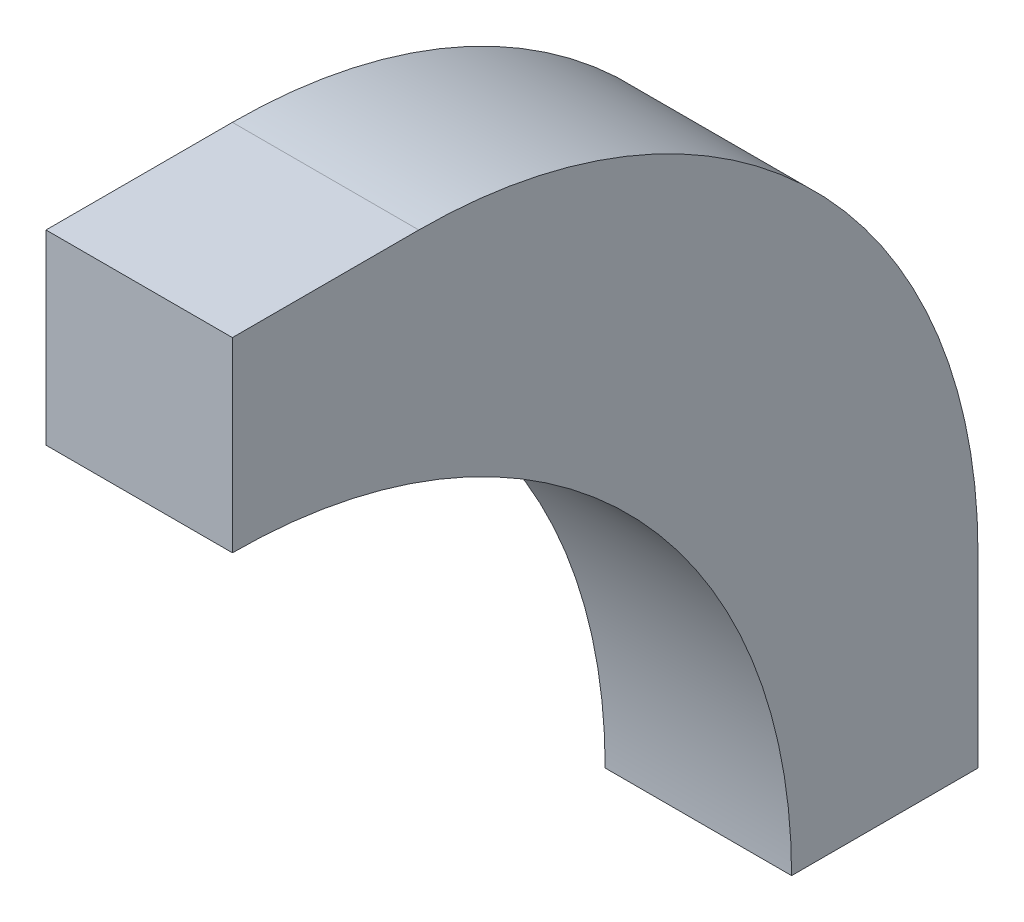
ISO-10303-21;
HEADER;
FILE_DESCRIPTION(('STEP AP214'),'2;1');
FILE_NAME('part.step','',(''),(''),'','','');
FILE_SCHEMA(('AUTOMOTIVE_DESIGN { 1 0 10303 214 1 1 1 1 }'));
ENDSEC;
DATA;
#1=APPLICATION_CONTEXT('core data for automotive mechanical design processes');
#2=APPLICATION_PROTOCOL_DEFINITION('international standard','automotive_design',2000,#1);
#3=PRODUCT_CONTEXT('',#1,'mechanical');
#4=PRODUCT('Part','Part','',(#3));
#5=PRODUCT_RELATED_PRODUCT_CATEGORY('part','',(#4));
#6=PRODUCT_DEFINITION_FORMATION('','',#4);
#7=PRODUCT_DEFINITION_CONTEXT('part definition',#1,'design');
#8=PRODUCT_DEFINITION('design','',#6,#7);
#9=PRODUCT_DEFINITION_SHAPE('','',#8);
#10=(LENGTH_UNIT() NAMED_UNIT(*) SI_UNIT(.MILLI.,.METRE.));
#11=(NAMED_UNIT(*) PLANE_ANGLE_UNIT() SI_UNIT($,.RADIAN.));
#12=(NAMED_UNIT(*) SI_UNIT($,.STERADIAN.) SOLID_ANGLE_UNIT());
#13=UNCERTAINTY_MEASURE_WITH_UNIT(LENGTH_MEASURE(1.E-05),#10,'distance_accuracy_value','');
#14=(GEOMETRIC_REPRESENTATION_CONTEXT(3) GLOBAL_UNCERTAINTY_ASSIGNED_CONTEXT((#13)) GLOBAL_UNIT_ASSIGNED_CONTEXT((#10,
#11,#12)) REPRESENTATION_CONTEXT('',''));
#15=CARTESIAN_POINT('',(0.,0.,0.));
#16=DIRECTION('',(0.,0.,1.));
#17=DIRECTION('',(1.,0.,0.));
#18=AXIS2_PLACEMENT_3D('',#15,#16,#17);
#19=CARTESIAN_POINT('',(12.7,0.,12.7));
#20=DIRECTION('',(0.,1.,0.));
#21=DIRECTION('',(0.,0.,1.));
#22=AXIS2_PLACEMENT_3D('',#19,#20,#21);
#23=PLANE('',#22);
#24=DIRECTION('',(0.,0.,-1.));
#25=VECTOR('',#24,1.);
#26=CARTESIAN_POINT('',(0.,0.,12.7));
#27=LINE('',#26,#25);
#28=CARTESIAN_POINT('',(0.,0.,12.7));
#29=VERTEX_POINT('',#28);
#30=CARTESIAN_POINT('',(0.,0.,0.));
#31=VERTEX_POINT('',#30);
#32=EDGE_CURVE('E103',#29,#31,#27,.T.);
#33=ORIENTED_EDGE('',*,*,#32,.T.);
#34=DIRECTION('',(-1.,0.,0.));
#35=VECTOR('',#34,1.);
#36=CARTESIAN_POINT('',(12.7,0.,0.));
#37=LINE('',#36,#35);
#38=CARTESIAN_POINT('',(12.7,0.,0.));
#39=VERTEX_POINT('',#38);
#40=EDGE_CURVE('E86',#39,#31,#37,.T.);
#41=ORIENTED_EDGE('',*,*,#40,.F.);
#42=DIRECTION('',(0.,0.,-1.));
#43=VECTOR('',#42,1.);
#44=CARTESIAN_POINT('',(12.7,0.,12.7));
#45=LINE('',#44,#43);
#46=CARTESIAN_POINT('',(12.7,0.,12.7));
#47=VERTEX_POINT('',#46);
#48=EDGE_CURVE('E91',#47,#39,#45,.T.);
#49=ORIENTED_EDGE('',*,*,#48,.F.);
#50=DIRECTION('',(-1.,0.,0.));
#51=VECTOR('',#50,1.);
#52=CARTESIAN_POINT('',(12.7,0.,12.7));
#53=LINE('',#52,#51);
#54=EDGE_CURVE('E133',#47,#29,#53,.T.);
#55=ORIENTED_EDGE('',*,*,#54,.T.);
#56=EDGE_LOOP('',(#33,#41,#49,#55));
#57=FACE_BOUND('',#56,.T.);
#58=ADVANCED_FACE('F33',(#57),#23,.F.);
#59=CARTESIAN_POINT('',(12.7,0.,0.));
#60=DIRECTION('',(0.,0.,1.));
#61=DIRECTION('',(1.,0.,0.));
#62=AXIS2_PLACEMENT_3D('',#59,#60,#61);
#63=PLANE('',#62);
#64=DIRECTION('',(0.,1.,0.));
#65=VECTOR('',#64,1.);
#66=CARTESIAN_POINT('',(0.,0.,0.));
#67=LINE('',#66,#65);
#68=CARTESIAN_POINT('',(0.,12.7,0.));
#69=VERTEX_POINT('',#68);
#70=EDGE_CURVE('E127',#31,#69,#67,.T.);
#71=ORIENTED_EDGE('',*,*,#70,.T.);
#72=DIRECTION('',(-1.,0.,0.));
#73=VECTOR('',#72,1.);
#74=CARTESIAN_POINT('',(12.7,12.7,0.));
#75=LINE('',#74,#73);
#76=CARTESIAN_POINT('',(12.7,12.7,0.));
#77=VERTEX_POINT('',#76);
#78=EDGE_CURVE('E41',#69,#77,#75,.F.);
#79=ORIENTED_EDGE('',*,*,#78,.T.);
#80=DIRECTION('',(0.,1.,0.));
#81=VECTOR('',#80,1.);
#82=CARTESIAN_POINT('',(12.7,0.,0.));
#83=LINE('',#82,#81);
#84=EDGE_CURVE('E82',#39,#77,#83,.T.);
#85=ORIENTED_EDGE('',*,*,#84,.F.);
#86=ORIENTED_EDGE('',*,*,#40,.T.);
#87=EDGE_LOOP('',(#71,#79,#85,#86));
#88=FACE_BOUND('',#87,.T.);
#89=ADVANCED_FACE('F84',(#88),#63,.F.);
#90=CARTESIAN_POINT('',(12.7,50.8,0.));
#91=DIRECTION('',(0.,-1.,0.));
#92=DIRECTION('',(0.,0.,-1.));
#93=AXIS2_PLACEMENT_3D('',#90,#91,#92);
#94=PLANE('',#93);
#95=DIRECTION('',(0.,0.,1.));
#96=VECTOR('',#95,1.);
#97=CARTESIAN_POINT('',(12.7,50.8,0.));
#98=LINE('',#97,#96);
#99=CARTESIAN_POINT('',(12.7,50.8,38.1));
#100=VERTEX_POINT('',#99);
#101=CARTESIAN_POINT('',(12.7,50.8,50.8));
#102=VERTEX_POINT('',#101);
#103=EDGE_CURVE('E90',#100,#102,#98,.T.);
#104=ORIENTED_EDGE('',*,*,#103,.F.);
#105=DIRECTION('',(-1.,0.,0.));
#106=VECTOR('',#105,1.);
#107=CARTESIAN_POINT('',(12.7,50.8,38.1));
#108=LINE('',#107,#106);
#109=CARTESIAN_POINT('',(0.,50.8,38.1));
#110=VERTEX_POINT('',#109);
#111=EDGE_CURVE('E114',#100,#110,#108,.T.);
#112=ORIENTED_EDGE('',*,*,#111,.T.);
#113=DIRECTION('',(0.,0.,1.));
#114=VECTOR('',#113,1.);
#115=CARTESIAN_POINT('',(0.,50.8,0.));
#116=LINE('',#115,#114);
#117=CARTESIAN_POINT('',(0.,50.8,50.8));
#118=VERTEX_POINT('',#117);
#119=EDGE_CURVE('E122',#110,#118,#116,.T.);
#120=ORIENTED_EDGE('',*,*,#119,.T.);
#121=DIRECTION('',(-1.,0.,0.));
#122=VECTOR('',#121,1.);
#123=CARTESIAN_POINT('',(12.7,50.8,50.8));
#124=LINE('',#123,#122);
#125=EDGE_CURVE('E105',#102,#118,#124,.T.);
#126=ORIENTED_EDGE('',*,*,#125,.F.);
#127=EDGE_LOOP('',(#104,#112,#120,#126));
#128=FACE_BOUND('',#127,.T.);
#129=ADVANCED_FACE('F120',(#128),#94,.F.);
#130=CARTESIAN_POINT('',(12.7,50.8,50.8));
#131=DIRECTION('',(0.,0.,-1.));
#132=DIRECTION('',(-1.,0.,0.));
#133=AXIS2_PLACEMENT_3D('',#130,#131,#132);
#134=PLANE('',#133);
#135=DIRECTION('',(0.,-1.,0.));
#136=VECTOR('',#135,1.);
#137=CARTESIAN_POINT('',(0.,50.8,50.8));
#138=LINE('',#137,#136);
#139=CARTESIAN_POINT('',(0.,38.1,50.8));
#140=VERTEX_POINT('',#139);
#141=EDGE_CURVE('E100',#118,#140,#138,.T.);
#142=ORIENTED_EDGE('',*,*,#141,.T.);
#143=DIRECTION('',(-1.,0.,0.));
#144=VECTOR('',#143,1.);
#145=CARTESIAN_POINT('',(12.7,38.1,50.8));
#146=LINE('',#145,#144);
#147=CARTESIAN_POINT('',(12.7,38.1,50.8));
#148=VERTEX_POINT('',#147);
#149=EDGE_CURVE('E109',#148,#140,#146,.T.);
#150=ORIENTED_EDGE('',*,*,#149,.F.);
#151=DIRECTION('',(0.,-1.,0.));
#152=VECTOR('',#151,1.);
#153=CARTESIAN_POINT('',(12.7,50.8,50.8));
#154=LINE('',#153,#152);
#155=EDGE_CURVE('E134',#102,#148,#154,.T.);
#156=ORIENTED_EDGE('',*,*,#155,.F.);
#157=ORIENTED_EDGE('',*,*,#125,.T.);
#158=EDGE_LOOP('',(#142,#150,#156,#157));
#159=FACE_BOUND('',#158,.T.);
#160=ADVANCED_FACE('F141',(#159),#134,.F.);
#161=CARTESIAN_POINT('',(12.7,0.,0.));
#162=DIRECTION('',(1.,0.,0.));
#163=DIRECTION('',(0.,0.,-1.));
#164=AXIS2_PLACEMENT_3D('',#161,#162,#163);
#165=PLANE('',#164);
#166=ORIENTED_EDGE('',*,*,#84,.T.);
#167=CARTESIAN_POINT('',(12.7,12.7,38.1));
#168=DIRECTION('',(1.,0.,0.));
#169=DIRECTION('',(0.,0.,-1.));
#170=AXIS2_PLACEMENT_3D('',#167,#168,#169);
#171=CIRCLE('',#170,38.1);
#172=EDGE_CURVE('E11',#77,#100,#171,.T.);
#173=ORIENTED_EDGE('',*,*,#172,.T.);
#174=ORIENTED_EDGE('',*,*,#103,.T.);
#175=ORIENTED_EDGE('',*,*,#155,.T.);
#176=CARTESIAN_POINT('',(12.7,0.,50.8));
#177=DIRECTION('',(1.,0.,0.));
#178=DIRECTION('',(0.,0.,-1.));
#179=AXIS2_PLACEMENT_3D('',#176,#177,#178);
#180=CIRCLE('',#179,38.1);
#181=EDGE_CURVE('E96',#148,#47,#180,.F.);
#182=ORIENTED_EDGE('',*,*,#181,.T.);
#183=ORIENTED_EDGE('',*,*,#48,.T.);
#184=EDGE_LOOP('',(#166,#173,#174,#175,#182,#183));
#185=FACE_BOUND('',#184,.T.);
#186=ADVANCED_FACE('F94',(#185),#165,.T.);
#187=CARTESIAN_POINT('',(0.,0.,0.));
#188=DIRECTION('',(1.,0.,0.));
#189=DIRECTION('',(0.,0.,-1.));
#190=AXIS2_PLACEMENT_3D('',#187,#188,#189);
#191=PLANE('',#190);
#192=ORIENTED_EDGE('',*,*,#119,.F.);
#193=CARTESIAN_POINT('',(0.,12.7,38.1));
#194=DIRECTION('',(1.,0.,0.));
#195=DIRECTION('',(0.,0.,-1.));
#196=AXIS2_PLACEMENT_3D('',#193,#194,#195);
#197=CIRCLE('',#196,38.1);
#198=EDGE_CURVE('E55',#110,#69,#197,.F.);
#199=ORIENTED_EDGE('',*,*,#198,.T.);
#200=ORIENTED_EDGE('',*,*,#70,.F.);
#201=ORIENTED_EDGE('',*,*,#32,.F.);
#202=CARTESIAN_POINT('',(0.,0.,50.8));
#203=DIRECTION('',(1.,0.,0.));
#204=DIRECTION('',(0.,0.,-1.));
#205=AXIS2_PLACEMENT_3D('',#202,#203,#204);
#206=CIRCLE('',#205,38.1);
#207=EDGE_CURVE('E104',#29,#140,#206,.T.);
#208=ORIENTED_EDGE('',*,*,#207,.T.);
#209=ORIENTED_EDGE('',*,*,#141,.F.);
#210=EDGE_LOOP('',(#192,#199,#200,#201,#208,#209));
#211=FACE_BOUND('',#210,.T.);
#212=ADVANCED_FACE('F125',(#211),#191,.F.);
#213=CARTESIAN_POINT('',(12.7,0.,50.8));
#214=DIRECTION('',(1.,0.,0.));
#215=DIRECTION('',(0.,0.,-1.));
#216=AXIS2_PLACEMENT_3D('',#213,#214,#215);
#217=CYLINDRICAL_SURFACE('',#216,38.1);
#218=ORIENTED_EDGE('',*,*,#181,.F.);
#219=ORIENTED_EDGE('',*,*,#149,.T.);
#220=ORIENTED_EDGE('',*,*,#207,.F.);
#221=ORIENTED_EDGE('',*,*,#54,.F.);
#222=EDGE_LOOP('',(#218,#219,#220,#221));
#223=FACE_BOUND('',#222,.T.);
#224=ADVANCED_FACE('F138',(#223),#217,.F.);
#225=CARTESIAN_POINT('',(12.7,12.7,38.1));
#226=DIRECTION('',(-1.,0.,0.));
#227=DIRECTION('',(0.,0.,1.));
#228=AXIS2_PLACEMENT_3D('',#225,#226,#227);
#229=CYLINDRICAL_SURFACE('',#228,38.1);
#230=ORIENTED_EDGE('',*,*,#172,.F.);
#231=ORIENTED_EDGE('',*,*,#78,.F.);
#232=ORIENTED_EDGE('',*,*,#198,.F.);
#233=ORIENTED_EDGE('',*,*,#111,.F.);
#234=EDGE_LOOP('',(#230,#231,#232,#233));
#235=FACE_BOUND('',#234,.T.);
#236=ADVANCED_FACE('F35',(#235),#229,.T.);
#237=CLOSED_SHELL('',(#58,#89,#129,#160,#186,#212,#224,#236));
#238=MANIFOLD_SOLID_BREP('B2',#237);
#239=ADVANCED_BREP_SHAPE_REPRESENTATION('',(#18,#238),#14);
#240=SHAPE_DEFINITION_REPRESENTATION(#9,#239);
ENDSEC;
END-ISO-10303-21;
